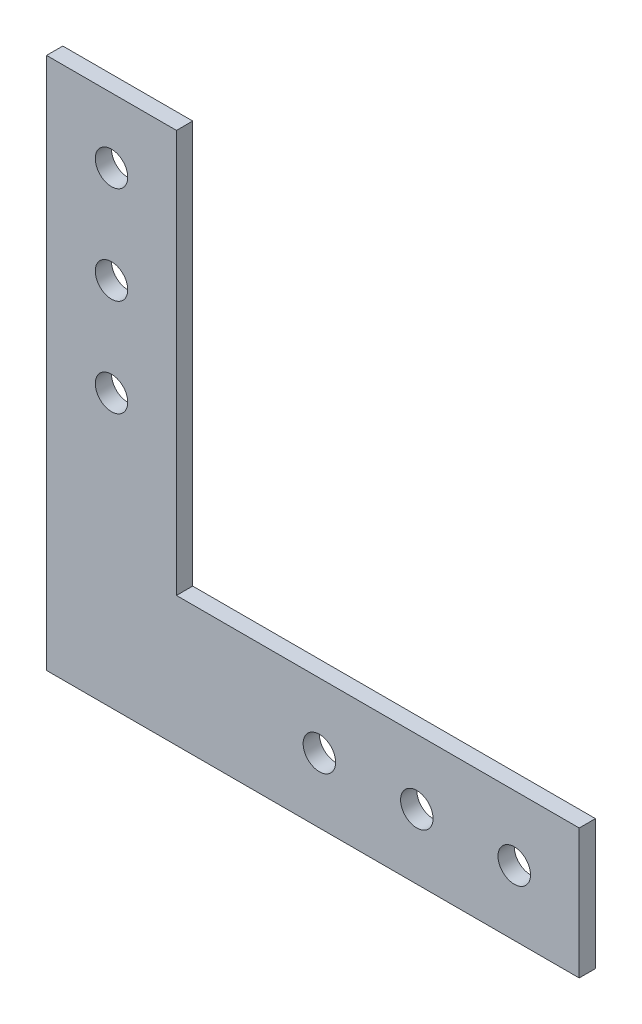
ISO-10303-21;
HEADER;
FILE_DESCRIPTION(('STEP AP214'),'2;1');
FILE_NAME('part.step','',(''),(''),'','','');
FILE_SCHEMA(('AUTOMOTIVE_DESIGN { 1 0 10303 214 1 1 1 1 }'));
ENDSEC;
DATA;
#1=APPLICATION_CONTEXT('core data for automotive mechanical design processes');
#2=APPLICATION_PROTOCOL_DEFINITION('international standard','automotive_design',2000,#1);
#3=PRODUCT_CONTEXT('',#1,'mechanical');
#4=PRODUCT('Part','Part','',(#3));
#5=PRODUCT_RELATED_PRODUCT_CATEGORY('part','',(#4));
#6=PRODUCT_DEFINITION_FORMATION('','',#4);
#7=PRODUCT_DEFINITION_CONTEXT('part definition',#1,'design');
#8=PRODUCT_DEFINITION('design','',#6,#7);
#9=PRODUCT_DEFINITION_SHAPE('','',#8);
#10=(LENGTH_UNIT() NAMED_UNIT(*) SI_UNIT(.MILLI.,.METRE.));
#11=(NAMED_UNIT(*) PLANE_ANGLE_UNIT() SI_UNIT($,.RADIAN.));
#12=(NAMED_UNIT(*) SI_UNIT($,.STERADIAN.) SOLID_ANGLE_UNIT());
#13=UNCERTAINTY_MEASURE_WITH_UNIT(LENGTH_MEASURE(1.E-05),#10,'distance_accuracy_value','');
#14=(GEOMETRIC_REPRESENTATION_CONTEXT(3) GLOBAL_UNCERTAINTY_ASSIGNED_CONTEXT((#13)) GLOBAL_UNIT_ASSIGNED_CONTEXT((#10,
#11,#12)) REPRESENTATION_CONTEXT('',''));
#15=CARTESIAN_POINT('',(0.,0.,0.));
#16=DIRECTION('',(0.,0.,1.));
#17=DIRECTION('',(1.,0.,0.));
#18=AXIS2_PLACEMENT_3D('',#15,#16,#17);
#19=CARTESIAN_POINT('',(0.,0.,3.175));
#20=DIRECTION('',(0.,1.,0.));
#21=DIRECTION('',(0.,0.,1.));
#22=AXIS2_PLACEMENT_3D('',#19,#20,#21);
#23=PLANE('',#22);
#24=DIRECTION('',(1.,0.,0.));
#25=VECTOR('',#24,1.);
#26=CARTESIAN_POINT('',(0.,0.,0.));
#27=LINE('',#26,#25);
#28=CARTESIAN_POINT('',(0.,0.,0.));
#29=VERTEX_POINT('',#28);
#30=CARTESIAN_POINT('',(104.14,0.,0.));
#31=VERTEX_POINT('',#30);
#32=EDGE_CURVE('E119',#29,#31,#27,.T.);
#33=ORIENTED_EDGE('',*,*,#32,.T.);
#34=DIRECTION('',(0.,0.,-1.));
#35=VECTOR('',#34,1.);
#36=CARTESIAN_POINT('',(104.14,0.,3.175));
#37=LINE('',#36,#35);
#38=CARTESIAN_POINT('',(104.14,0.,3.175));
#39=VERTEX_POINT('',#38);
#40=EDGE_CURVE('E11',#39,#31,#37,.T.);
#41=ORIENTED_EDGE('',*,*,#40,.F.);
#42=DIRECTION('',(1.,0.,0.));
#43=VECTOR('',#42,1.);
#44=CARTESIAN_POINT('',(0.,0.,3.175));
#45=LINE('',#44,#43);
#46=CARTESIAN_POINT('',(0.,0.,3.175));
#47=VERTEX_POINT('',#46);
#48=EDGE_CURVE('E134',#47,#39,#45,.T.);
#49=ORIENTED_EDGE('',*,*,#48,.F.);
#50=DIRECTION('',(0.,0.,-1.));
#51=VECTOR('',#50,1.);
#52=CARTESIAN_POINT('',(0.,0.,3.175));
#53=LINE('',#52,#51);
#54=EDGE_CURVE('E51',#47,#29,#53,.T.);
#55=ORIENTED_EDGE('',*,*,#54,.T.);
#56=EDGE_LOOP('',(#33,#41,#49,#55));
#57=FACE_BOUND('',#56,.T.);
#58=ADVANCED_FACE('F35',(#57),#23,.F.);
#59=CARTESIAN_POINT('',(104.14,0.,3.175));
#60=DIRECTION('',(-1.,0.,0.));
#61=DIRECTION('',(0.,0.,1.));
#62=AXIS2_PLACEMENT_3D('',#59,#60,#61);
#63=PLANE('',#62);
#64=DIRECTION('',(0.,1.,0.));
#65=VECTOR('',#64,1.);
#66=CARTESIAN_POINT('',(104.14,0.,0.));
#67=LINE('',#66,#65);
#68=CARTESIAN_POINT('',(104.14,25.4,0.));
#69=VERTEX_POINT('',#68);
#70=EDGE_CURVE('E121',#31,#69,#67,.T.);
#71=ORIENTED_EDGE('',*,*,#70,.T.);
#72=DIRECTION('',(0.,0.,-1.));
#73=VECTOR('',#72,1.);
#74=CARTESIAN_POINT('',(104.14,25.4,3.175));
#75=LINE('',#74,#73);
#76=CARTESIAN_POINT('',(104.14,25.4,3.175));
#77=VERTEX_POINT('',#76);
#78=EDGE_CURVE('E43',#77,#69,#75,.T.);
#79=ORIENTED_EDGE('',*,*,#78,.F.);
#80=DIRECTION('',(0.,1.,0.));
#81=VECTOR('',#80,1.);
#82=CARTESIAN_POINT('',(104.14,0.,3.175));
#83=LINE('',#82,#81);
#84=EDGE_CURVE('E83',#39,#77,#83,.T.);
#85=ORIENTED_EDGE('',*,*,#84,.F.);
#86=ORIENTED_EDGE('',*,*,#40,.T.);
#87=EDGE_LOOP('',(#71,#79,#85,#86));
#88=FACE_BOUND('',#87,.T.);
#89=ADVANCED_FACE('F140',(#88),#63,.F.);
#90=CARTESIAN_POINT('',(0.,25.4,3.175));
#91=DIRECTION('',(0.,1.,0.));
#92=DIRECTION('',(0.,0.,1.));
#93=AXIS2_PLACEMENT_3D('',#90,#91,#92);
#94=PLANE('',#93);
#95=DIRECTION('',(1.,0.,0.));
#96=VECTOR('',#95,1.);
#97=CARTESIAN_POINT('',(0.,25.4,0.));
#98=LINE('',#97,#96);
#99=CARTESIAN_POINT('',(25.4,25.4,0.));
#100=VERTEX_POINT('',#99);
#101=EDGE_CURVE('E125',#100,#69,#98,.T.);
#102=ORIENTED_EDGE('',*,*,#101,.F.);
#103=DIRECTION('',(0.,0.,-1.));
#104=VECTOR('',#103,1.);
#105=CARTESIAN_POINT('',(25.4,25.4,3.175));
#106=LINE('',#105,#104);
#107=CARTESIAN_POINT('',(25.4,25.4,3.175));
#108=VERTEX_POINT('',#107);
#109=EDGE_CURVE('E111',#108,#100,#106,.T.);
#110=ORIENTED_EDGE('',*,*,#109,.F.);
#111=DIRECTION('',(1.,0.,0.));
#112=VECTOR('',#111,1.);
#113=CARTESIAN_POINT('',(0.,25.4,3.175));
#114=LINE('',#113,#112);
#115=EDGE_CURVE('E101',#108,#77,#114,.T.);
#116=ORIENTED_EDGE('',*,*,#115,.T.);
#117=ORIENTED_EDGE('',*,*,#78,.T.);
#118=EDGE_LOOP('',(#102,#110,#116,#117));
#119=FACE_BOUND('',#118,.T.);
#120=ADVANCED_FACE('F139',(#119),#94,.T.);
#121=CARTESIAN_POINT('',(25.4,0.,3.175));
#122=DIRECTION('',(-1.,0.,0.));
#123=DIRECTION('',(0.,0.,1.));
#124=AXIS2_PLACEMENT_3D('',#121,#122,#123);
#125=PLANE('',#124);
#126=DIRECTION('',(0.,1.,0.));
#127=VECTOR('',#126,1.);
#128=CARTESIAN_POINT('',(25.4,0.,0.));
#129=LINE('',#128,#127);
#130=CARTESIAN_POINT('',(25.4,104.14,0.));
#131=VERTEX_POINT('',#130);
#132=EDGE_CURVE('E108',#100,#131,#129,.T.);
#133=ORIENTED_EDGE('',*,*,#132,.T.);
#134=DIRECTION('',(0.,0.,-1.));
#135=VECTOR('',#134,1.);
#136=CARTESIAN_POINT('',(25.4,104.14,3.175));
#137=LINE('',#136,#135);
#138=CARTESIAN_POINT('',(25.4,104.14,3.175));
#139=VERTEX_POINT('',#138);
#140=EDGE_CURVE('E105',#139,#131,#137,.T.);
#141=ORIENTED_EDGE('',*,*,#140,.F.);
#142=DIRECTION('',(0.,1.,0.));
#143=VECTOR('',#142,1.);
#144=CARTESIAN_POINT('',(25.4,0.,3.175));
#145=LINE('',#144,#143);
#146=EDGE_CURVE('E94',#108,#139,#145,.T.);
#147=ORIENTED_EDGE('',*,*,#146,.F.);
#148=ORIENTED_EDGE('',*,*,#109,.T.);
#149=EDGE_LOOP('',(#133,#141,#147,#148));
#150=FACE_BOUND('',#149,.T.);
#151=ADVANCED_FACE('F106',(#150),#125,.F.);
#152=CARTESIAN_POINT('',(0.,104.14,3.175));
#153=DIRECTION('',(0.,1.,0.));
#154=DIRECTION('',(0.,0.,1.));
#155=AXIS2_PLACEMENT_3D('',#152,#153,#154);
#156=PLANE('',#155);
#157=DIRECTION('',(1.,0.,0.));
#158=VECTOR('',#157,1.);
#159=CARTESIAN_POINT('',(0.,104.14,0.));
#160=LINE('',#159,#158);
#161=CARTESIAN_POINT('',(0.,104.14,0.));
#162=VERTEX_POINT('',#161);
#163=EDGE_CURVE('E129',#162,#131,#160,.T.);
#164=ORIENTED_EDGE('',*,*,#163,.F.);
#165=DIRECTION('',(0.,0.,-1.));
#166=VECTOR('',#165,1.);
#167=CARTESIAN_POINT('',(0.,104.14,3.175));
#168=LINE('',#167,#166);
#169=CARTESIAN_POINT('',(0.,104.14,3.175));
#170=VERTEX_POINT('',#169);
#171=EDGE_CURVE('E71',#170,#162,#168,.T.);
#172=ORIENTED_EDGE('',*,*,#171,.F.);
#173=DIRECTION('',(1.,0.,0.));
#174=VECTOR('',#173,1.);
#175=CARTESIAN_POINT('',(0.,104.14,3.175));
#176=LINE('',#175,#174);
#177=EDGE_CURVE('E99',#170,#139,#176,.T.);
#178=ORIENTED_EDGE('',*,*,#177,.T.);
#179=ORIENTED_EDGE('',*,*,#140,.T.);
#180=EDGE_LOOP('',(#164,#172,#178,#179));
#181=FACE_BOUND('',#180,.T.);
#182=ADVANCED_FACE('F113',(#181),#156,.T.);
#183=CARTESIAN_POINT('',(0.,0.,3.175));
#184=DIRECTION('',(-1.,0.,0.));
#185=DIRECTION('',(0.,0.,1.));
#186=AXIS2_PLACEMENT_3D('',#183,#184,#185);
#187=PLANE('',#186);
#188=DIRECTION('',(0.,1.,0.));
#189=VECTOR('',#188,1.);
#190=CARTESIAN_POINT('',(0.,0.,0.));
#191=LINE('',#190,#189);
#192=EDGE_CURVE('E131',#29,#162,#191,.T.);
#193=ORIENTED_EDGE('',*,*,#192,.F.);
#194=ORIENTED_EDGE('',*,*,#54,.F.);
#195=DIRECTION('',(0.,1.,0.));
#196=VECTOR('',#195,1.);
#197=CARTESIAN_POINT('',(0.,0.,3.175));
#198=LINE('',#197,#196);
#199=EDGE_CURVE('E114',#47,#170,#198,.T.);
#200=ORIENTED_EDGE('',*,*,#199,.T.);
#201=ORIENTED_EDGE('',*,*,#171,.T.);
#202=EDGE_LOOP('',(#193,#194,#200,#201));
#203=FACE_BOUND('',#202,.T.);
#204=ADVANCED_FACE('F144',(#203),#187,.T.);
#205=CARTESIAN_POINT('',(0.,0.,3.175));
#206=DIRECTION('',(0.,0.,1.));
#207=DIRECTION('',(1.,0.,0.));
#208=AXIS2_PLACEMENT_3D('',#205,#206,#207);
#209=PLANE('',#208);
#210=CARTESIAN_POINT('',(91.44,12.7,3.175));
#211=DIRECTION('',(0.,0.,1.));
#212=DIRECTION('',(1.,0.,0.));
#213=AXIS2_PLACEMENT_3D('',#210,#211,#212);
#214=CIRCLE('',#213,3.175);
#215=CARTESIAN_POINT('',(94.615,12.7,3.175));
#216=VERTEX_POINT('',#215);
#217=EDGE_CURVE('E192',#216,#216,#214,.T.);
#218=ORIENTED_EDGE('',*,*,#217,.F.);
#219=EDGE_LOOP('',(#218));
#220=FACE_BOUND('',#219,.T.);
#221=CARTESIAN_POINT('',(12.7,91.44,3.175));
#222=DIRECTION('',(0.,0.,1.));
#223=DIRECTION('',(1.,0.,0.));
#224=AXIS2_PLACEMENT_3D('',#221,#222,#223);
#225=CIRCLE('',#224,3.175);
#226=CARTESIAN_POINT('',(15.875,91.44,3.175));
#227=VERTEX_POINT('',#226);
#228=EDGE_CURVE('E186',#227,#227,#225,.T.);
#229=ORIENTED_EDGE('',*,*,#228,.F.);
#230=EDGE_LOOP('',(#229));
#231=FACE_BOUND('',#230,.T.);
#232=CARTESIAN_POINT('',(12.7,72.39,3.175));
#233=DIRECTION('',(0.,0.,1.));
#234=DIRECTION('',(1.,0.,0.));
#235=AXIS2_PLACEMENT_3D('',#232,#233,#234);
#236=CIRCLE('',#235,3.175);
#237=CARTESIAN_POINT('',(15.875,72.39,3.175));
#238=VERTEX_POINT('',#237);
#239=EDGE_CURVE('E180',#238,#238,#236,.T.);
#240=ORIENTED_EDGE('',*,*,#239,.F.);
#241=EDGE_LOOP('',(#240));
#242=FACE_BOUND('',#241,.T.);
#243=CARTESIAN_POINT('',(12.7,53.34,3.175));
#244=DIRECTION('',(0.,0.,1.));
#245=DIRECTION('',(1.,0.,0.));
#246=AXIS2_PLACEMENT_3D('',#243,#244,#245);
#247=CIRCLE('',#246,3.175);
#248=CARTESIAN_POINT('',(15.875,53.34,3.175));
#249=VERTEX_POINT('',#248);
#250=EDGE_CURVE('E174',#249,#249,#247,.T.);
#251=ORIENTED_EDGE('',*,*,#250,.F.);
#252=EDGE_LOOP('',(#251));
#253=FACE_BOUND('',#252,.T.);
#254=CARTESIAN_POINT('',(72.39,12.7,3.175));
#255=DIRECTION('',(0.,0.,1.));
#256=DIRECTION('',(1.,0.,0.));
#257=AXIS2_PLACEMENT_3D('',#254,#255,#256);
#258=CIRCLE('',#257,3.175);
#259=CARTESIAN_POINT('',(75.565,12.7,3.175));
#260=VERTEX_POINT('',#259);
#261=EDGE_CURVE('E168',#260,#260,#258,.T.);
#262=ORIENTED_EDGE('',*,*,#261,.F.);
#263=EDGE_LOOP('',(#262));
#264=FACE_BOUND('',#263,.T.);
#265=CARTESIAN_POINT('',(53.34,12.7,3.175));
#266=DIRECTION('',(0.,0.,1.));
#267=DIRECTION('',(1.,0.,0.));
#268=AXIS2_PLACEMENT_3D('',#265,#266,#267);
#269=CIRCLE('',#268,3.175);
#270=CARTESIAN_POINT('',(56.515,12.7,3.175));
#271=VERTEX_POINT('',#270);
#272=EDGE_CURVE('E162',#271,#271,#269,.T.);
#273=ORIENTED_EDGE('',*,*,#272,.F.);
#274=EDGE_LOOP('',(#273));
#275=FACE_BOUND('',#274,.T.);
#276=ORIENTED_EDGE('',*,*,#48,.T.);
#277=ORIENTED_EDGE('',*,*,#84,.T.);
#278=ORIENTED_EDGE('',*,*,#115,.F.);
#279=ORIENTED_EDGE('',*,*,#146,.T.);
#280=ORIENTED_EDGE('',*,*,#177,.F.);
#281=ORIENTED_EDGE('',*,*,#199,.F.);
#282=EDGE_LOOP('',(#276,#277,#278,#279,#280,#281));
#283=FACE_BOUND('',#282,.T.);
#284=ADVANCED_FACE('F96',(#220,#231,#242,#253,#264,#275,#283),#209,.T.);
#285=CARTESIAN_POINT('',(0.,0.,0.));
#286=DIRECTION('',(0.,0.,1.));
#287=DIRECTION('',(1.,0.,0.));
#288=AXIS2_PLACEMENT_3D('',#285,#286,#287);
#289=PLANE('',#288);
#290=CARTESIAN_POINT('',(91.44,12.7,0.));
#291=DIRECTION('',(0.,0.,1.));
#292=DIRECTION('',(1.,0.,0.));
#293=AXIS2_PLACEMENT_3D('',#290,#291,#292);
#294=CIRCLE('',#293,3.175);
#295=CARTESIAN_POINT('',(94.615,12.7,0.));
#296=VERTEX_POINT('',#295);
#297=EDGE_CURVE('E189',#296,#296,#294,.T.);
#298=ORIENTED_EDGE('',*,*,#297,.T.);
#299=EDGE_LOOP('',(#298));
#300=FACE_BOUND('',#299,.T.);
#301=CARTESIAN_POINT('',(12.7,91.44,0.));
#302=DIRECTION('',(0.,0.,1.));
#303=DIRECTION('',(1.,0.,0.));
#304=AXIS2_PLACEMENT_3D('',#301,#302,#303);
#305=CIRCLE('',#304,3.175);
#306=CARTESIAN_POINT('',(15.875,91.44,0.));
#307=VERTEX_POINT('',#306);
#308=EDGE_CURVE('E183',#307,#307,#305,.T.);
#309=ORIENTED_EDGE('',*,*,#308,.T.);
#310=EDGE_LOOP('',(#309));
#311=FACE_BOUND('',#310,.T.);
#312=CARTESIAN_POINT('',(12.7,72.39,0.));
#313=DIRECTION('',(0.,0.,1.));
#314=DIRECTION('',(1.,0.,0.));
#315=AXIS2_PLACEMENT_3D('',#312,#313,#314);
#316=CIRCLE('',#315,3.175);
#317=CARTESIAN_POINT('',(15.875,72.39,0.));
#318=VERTEX_POINT('',#317);
#319=EDGE_CURVE('E177',#318,#318,#316,.T.);
#320=ORIENTED_EDGE('',*,*,#319,.T.);
#321=EDGE_LOOP('',(#320));
#322=FACE_BOUND('',#321,.T.);
#323=CARTESIAN_POINT('',(12.7,53.34,0.));
#324=DIRECTION('',(0.,0.,1.));
#325=DIRECTION('',(1.,0.,0.));
#326=AXIS2_PLACEMENT_3D('',#323,#324,#325);
#327=CIRCLE('',#326,3.175);
#328=CARTESIAN_POINT('',(15.875,53.34,0.));
#329=VERTEX_POINT('',#328);
#330=EDGE_CURVE('E171',#329,#329,#327,.T.);
#331=ORIENTED_EDGE('',*,*,#330,.T.);
#332=EDGE_LOOP('',(#331));
#333=FACE_BOUND('',#332,.T.);
#334=CARTESIAN_POINT('',(72.39,12.7,0.));
#335=DIRECTION('',(0.,0.,1.));
#336=DIRECTION('',(1.,0.,0.));
#337=AXIS2_PLACEMENT_3D('',#334,#335,#336);
#338=CIRCLE('',#337,3.175);
#339=CARTESIAN_POINT('',(75.565,12.7,0.));
#340=VERTEX_POINT('',#339);
#341=EDGE_CURVE('E165',#340,#340,#338,.T.);
#342=ORIENTED_EDGE('',*,*,#341,.T.);
#343=EDGE_LOOP('',(#342));
#344=FACE_BOUND('',#343,.T.);
#345=CARTESIAN_POINT('',(53.34,12.7,0.));
#346=DIRECTION('',(0.,0.,1.));
#347=DIRECTION('',(1.,0.,0.));
#348=AXIS2_PLACEMENT_3D('',#345,#346,#347);
#349=CIRCLE('',#348,3.175);
#350=CARTESIAN_POINT('',(56.515,12.7,0.));
#351=VERTEX_POINT('',#350);
#352=EDGE_CURVE('E122',#351,#351,#349,.T.);
#353=ORIENTED_EDGE('',*,*,#352,.T.);
#354=EDGE_LOOP('',(#353));
#355=FACE_BOUND('',#354,.T.);
#356=ORIENTED_EDGE('',*,*,#32,.F.);
#357=ORIENTED_EDGE('',*,*,#192,.T.);
#358=ORIENTED_EDGE('',*,*,#163,.T.);
#359=ORIENTED_EDGE('',*,*,#132,.F.);
#360=ORIENTED_EDGE('',*,*,#101,.T.);
#361=ORIENTED_EDGE('',*,*,#70,.F.);
#362=EDGE_LOOP('',(#356,#357,#358,#359,#360,#361));
#363=FACE_BOUND('',#362,.T.);
#364=ADVANCED_FACE('F143',(#300,#311,#322,#333,#344,#355,#363),#289,.F.);
#365=CARTESIAN_POINT('',(53.34,12.7,0.));
#366=DIRECTION('',(0.,0.,1.));
#367=DIRECTION('',(1.,0.,0.));
#368=AXIS2_PLACEMENT_3D('',#365,#366,#367);
#369=CYLINDRICAL_SURFACE('',#368,3.175);
#370=ORIENTED_EDGE('',*,*,#352,.F.);
#371=EDGE_LOOP('',(#370));
#372=FACE_BOUND('',#371,.T.);
#373=ORIENTED_EDGE('',*,*,#272,.T.);
#374=EDGE_LOOP('',(#373));
#375=FACE_BOUND('',#374,.T.);
#376=ADVANCED_FACE('F217',(#372,#375),#369,.F.);
#377=CARTESIAN_POINT('',(72.39,12.7,0.));
#378=DIRECTION('',(0.,0.,1.));
#379=DIRECTION('',(1.,0.,0.));
#380=AXIS2_PLACEMENT_3D('',#377,#378,#379);
#381=CYLINDRICAL_SURFACE('',#380,3.175);
#382=ORIENTED_EDGE('',*,*,#341,.F.);
#383=EDGE_LOOP('',(#382));
#384=FACE_BOUND('',#383,.T.);
#385=ORIENTED_EDGE('',*,*,#261,.T.);
#386=EDGE_LOOP('',(#385));
#387=FACE_BOUND('',#386,.T.);
#388=ADVANCED_FACE('F219',(#384,#387),#381,.F.);
#389=CARTESIAN_POINT('',(12.7,53.34,0.));
#390=DIRECTION('',(0.,0.,1.));
#391=DIRECTION('',(1.,0.,0.));
#392=AXIS2_PLACEMENT_3D('',#389,#390,#391);
#393=CYLINDRICAL_SURFACE('',#392,3.175);
#394=ORIENTED_EDGE('',*,*,#330,.F.);
#395=EDGE_LOOP('',(#394));
#396=FACE_BOUND('',#395,.T.);
#397=ORIENTED_EDGE('',*,*,#250,.T.);
#398=EDGE_LOOP('',(#397));
#399=FACE_BOUND('',#398,.T.);
#400=ADVANCED_FACE('F226',(#396,#399),#393,.F.);
#401=CARTESIAN_POINT('',(12.7,72.39,0.));
#402=DIRECTION('',(0.,0.,1.));
#403=DIRECTION('',(1.,0.,0.));
#404=AXIS2_PLACEMENT_3D('',#401,#402,#403);
#405=CYLINDRICAL_SURFACE('',#404,3.175);
#406=ORIENTED_EDGE('',*,*,#319,.F.);
#407=EDGE_LOOP('',(#406));
#408=FACE_BOUND('',#407,.T.);
#409=ORIENTED_EDGE('',*,*,#239,.T.);
#410=EDGE_LOOP('',(#409));
#411=FACE_BOUND('',#410,.T.);
#412=ADVANCED_FACE('F233',(#408,#411),#405,.F.);
#413=CARTESIAN_POINT('',(12.7,91.44,0.));
#414=DIRECTION('',(0.,0.,1.));
#415=DIRECTION('',(1.,0.,0.));
#416=AXIS2_PLACEMENT_3D('',#413,#414,#415);
#417=CYLINDRICAL_SURFACE('',#416,3.175);
#418=ORIENTED_EDGE('',*,*,#308,.F.);
#419=EDGE_LOOP('',(#418));
#420=FACE_BOUND('',#419,.T.);
#421=ORIENTED_EDGE('',*,*,#228,.T.);
#422=EDGE_LOOP('',(#421));
#423=FACE_BOUND('',#422,.T.);
#424=ADVANCED_FACE('F203',(#420,#423),#417,.F.);
#425=CARTESIAN_POINT('',(91.44,12.7,0.));
#426=DIRECTION('',(0.,0.,1.));
#427=DIRECTION('',(1.,0.,0.));
#428=AXIS2_PLACEMENT_3D('',#425,#426,#427);
#429=CYLINDRICAL_SURFACE('',#428,3.175);
#430=ORIENTED_EDGE('',*,*,#297,.F.);
#431=EDGE_LOOP('',(#430));
#432=FACE_BOUND('',#431,.T.);
#433=ORIENTED_EDGE('',*,*,#217,.T.);
#434=EDGE_LOOP('',(#433));
#435=FACE_BOUND('',#434,.T.);
#436=ADVANCED_FACE('F200',(#432,#435),#429,.F.);
#437=CLOSED_SHELL('',(#58,#89,#120,#151,#182,#204,#284,#364,#376,#388,#400,#412,#424,#436));
#438=MANIFOLD_SOLID_BREP('B2',#437);
#439=ADVANCED_BREP_SHAPE_REPRESENTATION('',(#18,#438),#14);
#440=SHAPE_DEFINITION_REPRESENTATION(#9,#439);
ENDSEC;
END-ISO-10303-21;
